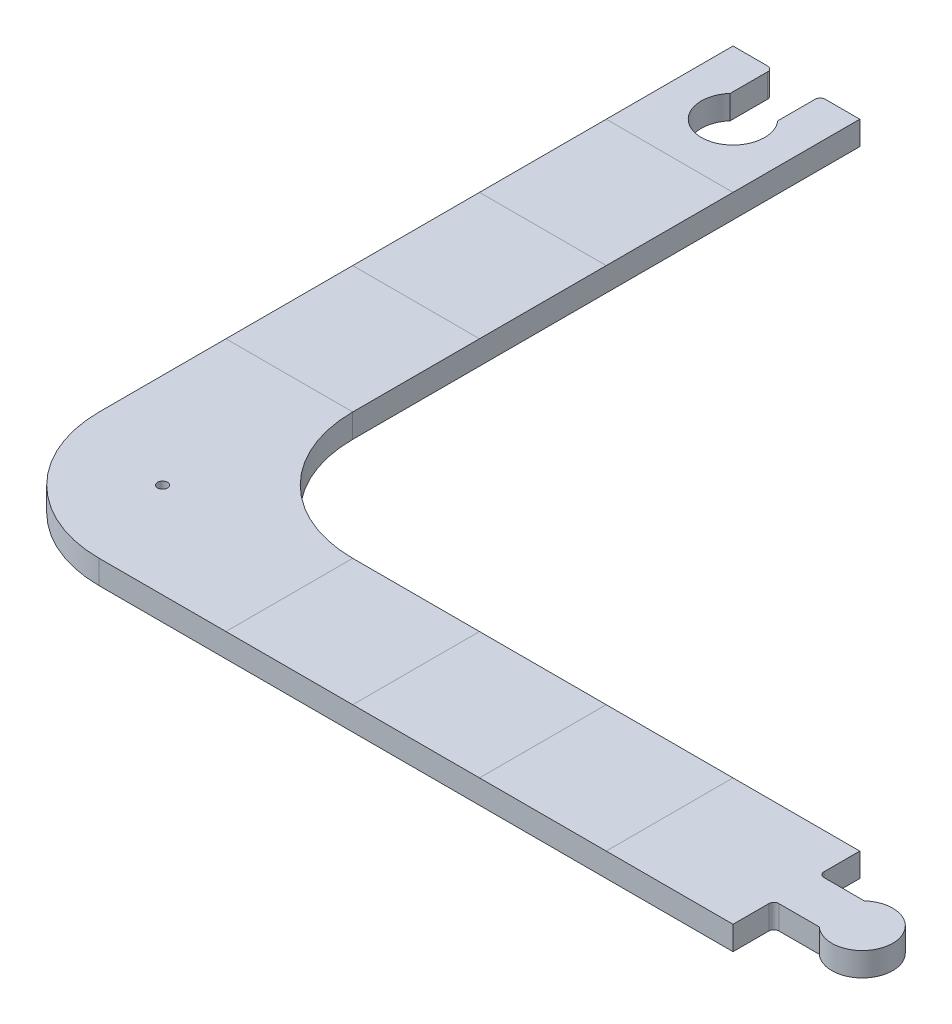
ISO-10303-21;
HEADER;
FILE_DESCRIPTION(('STEP AP214'),'2;1');
FILE_NAME('part.step','',(''),(''),'','','');
FILE_SCHEMA(('AUTOMOTIVE_DESIGN { 1 0 10303 214 1 1 1 1 }'));
ENDSEC;
DATA;
#1=APPLICATION_CONTEXT('core data for automotive mechanical design processes');
#2=APPLICATION_PROTOCOL_DEFINITION('international standard','automotive_design',2000,#1);
#3=PRODUCT_CONTEXT('',#1,'mechanical');
#4=PRODUCT('Part','Part','',(#3));
#5=PRODUCT_RELATED_PRODUCT_CATEGORY('part','',(#4));
#6=PRODUCT_DEFINITION_FORMATION('','',#4);
#7=PRODUCT_DEFINITION_CONTEXT('part definition',#1,'design');
#8=PRODUCT_DEFINITION('design','',#6,#7);
#9=PRODUCT_DEFINITION_SHAPE('','',#8);
#10=(LENGTH_UNIT() NAMED_UNIT(*) SI_UNIT(.MILLI.,.METRE.));
#11=(NAMED_UNIT(*) PLANE_ANGLE_UNIT() SI_UNIT($,.RADIAN.));
#12=(NAMED_UNIT(*) SI_UNIT($,.STERADIAN.) SOLID_ANGLE_UNIT());
#13=UNCERTAINTY_MEASURE_WITH_UNIT(LENGTH_MEASURE(1.E-05),#10,'distance_accuracy_value','');
#14=(GEOMETRIC_REPRESENTATION_CONTEXT(3) GLOBAL_UNCERTAINTY_ASSIGNED_CONTEXT((#13)) GLOBAL_UNIT_ASSIGNED_CONTEXT((#10,
#11,#12)) REPRESENTATION_CONTEXT('',''));
#15=CARTESIAN_POINT('',(0.,0.,0.));
#16=DIRECTION('',(0.,0.,1.));
#17=DIRECTION('',(1.,0.,0.));
#18=AXIS2_PLACEMENT_3D('',#15,#16,#17);
#19=CARTESIAN_POINT('',(25.4,4.7625,-25.4));
#20=DIRECTION('',(0.,1.,0.));
#21=DIRECTION('',(0.,0.,1.));
#22=AXIS2_PLACEMENT_3D('',#19,#20,#21);
#23=PLANE('',#22);
#24=CARTESIAN_POINT('',(19.0499999999999,4.7625,-19.05));
#25=DIRECTION('',(0.,1.,0.));
#26=DIRECTION('',(0.,0.,1.));
#27=AXIS2_PLACEMENT_3D('',#24,#25,#26);
#28=CIRCLE('',#27,1.);
#29=CARTESIAN_POINT('',(19.0499999999999,4.7625,-18.05));
#30=VERTEX_POINT('',#29);
#31=EDGE_CURVE('E248',#30,#30,#28,.T.);
#32=ORIENTED_EDGE('',*,*,#31,.F.);
#33=EDGE_LOOP('',(#32));
#34=FACE_BOUND('',#33,.T.);
#35=CARTESIAN_POINT('',(50.8,4.7625,-50.8));
#36=DIRECTION('',(0.,-1.,0.));
#37=DIRECTION('',(0.,0.,1.));
#38=AXIS2_PLACEMENT_3D('',#35,#36,#37);
#39=CIRCLE('',#38,25.4);
#40=CARTESIAN_POINT('',(50.8,4.7625,-25.4));
#41=VERTEX_POINT('',#40);
#42=CARTESIAN_POINT('',(25.4,4.7625,-50.8000000000002));
#43=VERTEX_POINT('',#42);
#44=EDGE_CURVE('E435',#41,#43,#39,.T.);
#45=ORIENTED_EDGE('',*,*,#44,.T.);
#46=DIRECTION('',(-1.,0.,0.));
#47=VECTOR('',#46,1.);
#48=CARTESIAN_POINT('',(25.4,4.7625,-50.8));
#49=LINE('',#48,#47);
#50=CARTESIAN_POINT('',(0.,4.7625,-50.8));
#51=VERTEX_POINT('',#50);
#52=EDGE_CURVE('E11',#43,#51,#49,.T.);
#53=ORIENTED_EDGE('',*,*,#52,.T.);
#54=DIRECTION('',(0.,0.,1.));
#55=VECTOR('',#54,1.);
#56=CARTESIAN_POINT('',(0.,4.7625,-25.4000000000002));
#57=LINE('',#56,#55);
#58=CARTESIAN_POINT('',(0.,4.7625,-25.4000000000002));
#59=VERTEX_POINT('',#58);
#60=EDGE_CURVE('E227',#51,#59,#57,.T.);
#61=ORIENTED_EDGE('',*,*,#60,.T.);
#62=CARTESIAN_POINT('',(25.4,4.7625,-25.4));
#63=DIRECTION('',(0.,1.,0.));
#64=DIRECTION('',(0.,0.,1.));
#65=AXIS2_PLACEMENT_3D('',#62,#63,#64);
#66=CIRCLE('',#65,25.4);
#67=CARTESIAN_POINT('',(25.4000000000002,4.7625,0.));
#68=VERTEX_POINT('',#67);
#69=EDGE_CURVE('E226',#59,#68,#66,.T.);
#70=ORIENTED_EDGE('',*,*,#69,.T.);
#71=DIRECTION('',(1.,0.,0.));
#72=VECTOR('',#71,1.);
#73=CARTESIAN_POINT('',(25.4000000000002,4.7625,0.));
#74=LINE('',#73,#72);
#75=CARTESIAN_POINT('',(50.8,4.7625,0.));
#76=VERTEX_POINT('',#75);
#77=EDGE_CURVE('E214',#68,#76,#74,.T.);
#78=ORIENTED_EDGE('',*,*,#77,.T.);
#79=DIRECTION('',(0.,0.,-1.));
#80=VECTOR('',#79,1.);
#81=CARTESIAN_POINT('',(50.8,4.7625,-25.4));
#82=LINE('',#81,#80);
#83=EDGE_CURVE('E258',#76,#41,#82,.T.);
#84=ORIENTED_EDGE('',*,*,#83,.T.);
#85=EDGE_LOOP('',(#45,#53,#61,#70,#78,#84));
#86=FACE_BOUND('',#85,.T.);
#87=ADVANCED_FACE('F35',(#34,#86),#23,.T.);
#88=ORIENTED_EDGE('',*,*,#52,.F.);
#89=DIRECTION('',(0.,0.,-1.));
#90=VECTOR('',#89,1.);
#91=CARTESIAN_POINT('',(25.4,4.7625,-152.4));
#92=LINE('',#91,#90);
#93=CARTESIAN_POINT('',(25.4,4.7625,-76.2));
#94=VERTEX_POINT('',#93);
#95=EDGE_CURVE('E439',#43,#94,#92,.T.);
#96=ORIENTED_EDGE('',*,*,#95,.T.);
#97=DIRECTION('',(-1.,0.,0.));
#98=VECTOR('',#97,1.);
#99=CARTESIAN_POINT('',(25.4,4.7625,-76.2));
#100=LINE('',#99,#98);
#101=CARTESIAN_POINT('',(0.,4.7625,-76.2));
#102=VERTEX_POINT('',#101);
#103=EDGE_CURVE('E44',#94,#102,#100,.T.);
#104=ORIENTED_EDGE('',*,*,#103,.T.);
#105=EDGE_CURVE('E297',#102,#51,#57,.T.);
#106=ORIENTED_EDGE('',*,*,#105,.T.);
#107=EDGE_LOOP('',(#88,#96,#104,#106));
#108=FACE_BOUND('',#107,.T.);
#109=ADVANCED_FACE('F456',(#108),#23,.T.);
#110=ORIENTED_EDGE('',*,*,#103,.F.);
#111=CARTESIAN_POINT('',(25.4,4.7625,-101.6));
#112=VERTEX_POINT('',#111);
#113=EDGE_CURVE('E287',#94,#112,#92,.T.);
#114=ORIENTED_EDGE('',*,*,#113,.T.);
#115=DIRECTION('',(-1.,0.,0.));
#116=VECTOR('',#115,1.);
#117=CARTESIAN_POINT('',(25.4,4.7625,-101.6));
#118=LINE('',#117,#116);
#119=CARTESIAN_POINT('',(0.,4.7625,-101.6));
#120=VERTEX_POINT('',#119);
#121=EDGE_CURVE('E261',#112,#120,#118,.T.);
#122=ORIENTED_EDGE('',*,*,#121,.T.);
#123=EDGE_CURVE('E285',#120,#102,#57,.T.);
#124=ORIENTED_EDGE('',*,*,#123,.T.);
#125=EDGE_LOOP('',(#110,#114,#122,#124));
#126=FACE_BOUND('',#125,.T.);
#127=ADVANCED_FACE('F284',(#126),#23,.T.);
#128=ORIENTED_EDGE('',*,*,#121,.F.);
#129=CARTESIAN_POINT('',(25.4,4.7625,-127.));
#130=VERTEX_POINT('',#129);
#131=EDGE_CURVE('E468',#112,#130,#92,.T.);
#132=ORIENTED_EDGE('',*,*,#131,.T.);
#133=DIRECTION('',(-1.,0.,0.));
#134=VECTOR('',#133,1.);
#135=CARTESIAN_POINT('',(25.4,4.7625,-127.));
#136=LINE('',#135,#134);
#137=CARTESIAN_POINT('',(0.,4.7625,-127.));
#138=VERTEX_POINT('',#137);
#139=EDGE_CURVE('E239',#130,#138,#136,.T.);
#140=ORIENTED_EDGE('',*,*,#139,.T.);
#141=EDGE_CURVE('E295',#138,#120,#57,.T.);
#142=ORIENTED_EDGE('',*,*,#141,.T.);
#143=EDGE_LOOP('',(#128,#132,#140,#142));
#144=FACE_BOUND('',#143,.T.);
#145=ADVANCED_FACE('F299',(#144),#23,.T.);
#146=ORIENTED_EDGE('',*,*,#83,.F.);
#147=CARTESIAN_POINT('',(76.2,4.7625,0.));
#148=VERTEX_POINT('',#147);
#149=EDGE_CURVE('E221',#76,#148,#74,.T.);
#150=ORIENTED_EDGE('',*,*,#149,.T.);
#151=DIRECTION('',(0.,0.,-1.));
#152=VECTOR('',#151,1.);
#153=CARTESIAN_POINT('',(76.2,4.7625,-25.4000000000001));
#154=LINE('',#153,#152);
#155=CARTESIAN_POINT('',(76.2,4.7625,-25.4));
#156=VERTEX_POINT('',#155);
#157=EDGE_CURVE('E255',#148,#156,#154,.T.);
#158=ORIENTED_EDGE('',*,*,#157,.T.);
#159=DIRECTION('',(-1.,0.,0.));
#160=VECTOR('',#159,1.);
#161=CARTESIAN_POINT('',(152.4,4.7625,-25.4));
#162=LINE('',#161,#160);
#163=EDGE_CURVE('E431',#156,#41,#162,.T.);
#164=ORIENTED_EDGE('',*,*,#163,.T.);
#165=EDGE_LOOP('',(#146,#150,#158,#164));
#166=FACE_BOUND('',#165,.T.);
#167=ADVANCED_FACE('F541',(#166),#23,.T.);
#168=ORIENTED_EDGE('',*,*,#157,.F.);
#169=CARTESIAN_POINT('',(101.6,4.7625,0.));
#170=VERTEX_POINT('',#169);
#171=EDGE_CURVE('E550',#148,#170,#74,.T.);
#172=ORIENTED_EDGE('',*,*,#171,.T.);
#173=DIRECTION('',(0.,0.,-1.));
#174=VECTOR('',#173,1.);
#175=CARTESIAN_POINT('',(101.6,4.7625,-25.4000000000001));
#176=LINE('',#175,#174);
#177=CARTESIAN_POINT('',(101.6,4.7625,-25.4));
#178=VERTEX_POINT('',#177);
#179=EDGE_CURVE('E252',#170,#178,#176,.T.);
#180=ORIENTED_EDGE('',*,*,#179,.T.);
#181=EDGE_CURVE('E555',#178,#156,#162,.T.);
#182=ORIENTED_EDGE('',*,*,#181,.T.);
#183=EDGE_LOOP('',(#168,#172,#180,#182));
#184=FACE_BOUND('',#183,.T.);
#185=ADVANCED_FACE('F536',(#184),#23,.T.);
#186=ORIENTED_EDGE('',*,*,#179,.F.);
#187=CARTESIAN_POINT('',(127.,4.7625,0.));
#188=VERTEX_POINT('',#187);
#189=EDGE_CURVE('E546',#170,#188,#74,.T.);
#190=ORIENTED_EDGE('',*,*,#189,.T.);
#191=DIRECTION('',(0.,0.,-1.));
#192=VECTOR('',#191,1.);
#193=CARTESIAN_POINT('',(127.,4.7625,-25.4000000000001));
#194=LINE('',#193,#192);
#195=CARTESIAN_POINT('',(127.,4.7625,-25.4));
#196=VERTEX_POINT('',#195);
#197=EDGE_CURVE('E235',#188,#196,#194,.T.);
#198=ORIENTED_EDGE('',*,*,#197,.T.);
#199=EDGE_CURVE('E436',#196,#178,#162,.T.);
#200=ORIENTED_EDGE('',*,*,#199,.T.);
#201=EDGE_LOOP('',(#186,#190,#198,#200));
#202=FACE_BOUND('',#201,.T.);
#203=ADVANCED_FACE('F531',(#202),#23,.T.);
#204=ORIENTED_EDGE('',*,*,#139,.F.);
#205=CARTESIAN_POINT('',(25.4,4.7625,-152.4));
#206=VERTEX_POINT('',#205);
#207=EDGE_CURVE('E438',#130,#206,#92,.T.);
#208=ORIENTED_EDGE('',*,*,#207,.T.);
#209=DIRECTION('',(-1.,0.,0.));
#210=VECTOR('',#209,1.);
#211=CARTESIAN_POINT('',(18.4625,4.7625,-152.4));
#212=LINE('',#211,#210);
#213=CARTESIAN_POINT('',(18.4625,4.7625,-152.4));
#214=VERTEX_POINT('',#213);
#215=EDGE_CURVE('E441',#206,#214,#212,.T.);
#216=ORIENTED_EDGE('',*,*,#215,.T.);
#217=CARTESIAN_POINT('',(18.4625,4.7625,-151.4));
#218=DIRECTION('',(0.,1.,0.));
#219=DIRECTION('',(0.,0.,1.));
#220=AXIS2_PLACEMENT_3D('',#217,#218,#219);
#221=CIRCLE('',#220,1.);
#222=CARTESIAN_POINT('',(17.4625,4.7625,-151.4));
#223=VERTEX_POINT('',#222);
#224=EDGE_CURVE('E443',#214,#223,#221,.T.);
#225=ORIENTED_EDGE('',*,*,#224,.T.);
#226=DIRECTION('',(0.,0.,1.));
#227=VECTOR('',#226,1.);
#228=CARTESIAN_POINT('',(17.4625,4.7625,-151.4));
#229=LINE('',#228,#227);
#230=CARTESIAN_POINT('',(17.4625,4.7625,-143.900130206315));
#231=VERTEX_POINT('',#230);
#232=EDGE_CURVE('E445',#223,#231,#229,.T.);
#233=ORIENTED_EDGE('',*,*,#232,.T.);
#234=CARTESIAN_POINT('',(12.7,4.7625,-139.7));
#235=DIRECTION('',(0.,-1.,0.));
#236=DIRECTION('',(0.,0.,1.));
#237=AXIS2_PLACEMENT_3D('',#234,#235,#236);
#238=CIRCLE('',#237,6.35);
#239=CARTESIAN_POINT('',(7.9375,4.7625,-143.900130206315));
#240=VERTEX_POINT('',#239);
#241=EDGE_CURVE('E447',#231,#240,#238,.T.);
#242=ORIENTED_EDGE('',*,*,#241,.T.);
#243=DIRECTION('',(0.,0.,-1.));
#244=VECTOR('',#243,1.);
#245=CARTESIAN_POINT('',(7.9375,4.7625,-151.4));
#246=LINE('',#245,#244);
#247=CARTESIAN_POINT('',(7.9375,4.7625,-151.4));
#248=VERTEX_POINT('',#247);
#249=EDGE_CURVE('E449',#240,#248,#246,.T.);
#250=ORIENTED_EDGE('',*,*,#249,.T.);
#251=CARTESIAN_POINT('',(6.9375,4.7625,-151.4));
#252=DIRECTION('',(0.,1.,0.));
#253=DIRECTION('',(0.,0.,-1.));
#254=AXIS2_PLACEMENT_3D('',#251,#252,#253);
#255=CIRCLE('',#254,1.);
#256=CARTESIAN_POINT('',(6.93749999999999,4.7625,-152.4));
#257=VERTEX_POINT('',#256);
#258=EDGE_CURVE('E450',#248,#257,#255,.T.);
#259=ORIENTED_EDGE('',*,*,#258,.T.);
#260=DIRECTION('',(-1.,0.,0.));
#261=VECTOR('',#260,1.);
#262=CARTESIAN_POINT('',(0.,4.7625,-152.4));
#263=LINE('',#262,#261);
#264=CARTESIAN_POINT('',(0.,4.7625,-152.4));
#265=VERTEX_POINT('',#264);
#266=EDGE_CURVE('E305',#257,#265,#263,.T.);
#267=ORIENTED_EDGE('',*,*,#266,.T.);
#268=EDGE_CURVE('E301',#265,#138,#57,.T.);
#269=ORIENTED_EDGE('',*,*,#268,.T.);
#270=EDGE_LOOP('',(#204,#208,#216,#225,#233,#242,#250,#259,#267,#269));
#271=FACE_BOUND('',#270,.T.);
#272=ADVANCED_FACE('F470',(#271),#23,.T.);
#273=CARTESIAN_POINT('',(25.4,4.7625,-25.4));
#274=DIRECTION('',(0.,-1.,0.));
#275=DIRECTION('',(0.,0.,-1.));
#276=AXIS2_PLACEMENT_3D('',#273,#274,#275);
#277=CYLINDRICAL_SURFACE('',#276,25.4);
#278=CARTESIAN_POINT('',(25.4,0.,-25.4));
#279=DIRECTION('',(0.,1.,0.));
#280=DIRECTION('',(0.,0.,1.));
#281=AXIS2_PLACEMENT_3D('',#278,#279,#280);
#282=CIRCLE('',#281,25.4);
#283=CARTESIAN_POINT('',(0.,0.,-25.4000000000002));
#284=VERTEX_POINT('',#283);
#285=CARTESIAN_POINT('',(25.4000000000002,0.,0.));
#286=VERTEX_POINT('',#285);
#287=EDGE_CURVE('E234',#284,#286,#282,.T.);
#288=ORIENTED_EDGE('',*,*,#287,.T.);
#289=DIRECTION('',(0.,-1.,0.));
#290=VECTOR('',#289,1.);
#291=CARTESIAN_POINT('',(25.4000000000002,4.7625,0.));
#292=LINE('',#291,#290);
#293=EDGE_CURVE('E218',#68,#286,#292,.T.);
#294=ORIENTED_EDGE('',*,*,#293,.F.);
#295=ORIENTED_EDGE('',*,*,#69,.F.);
#296=DIRECTION('',(0.,-1.,0.));
#297=VECTOR('',#296,1.);
#298=CARTESIAN_POINT('',(0.,4.7625,-25.4000000000002));
#299=LINE('',#298,#297);
#300=EDGE_CURVE('E302',#59,#284,#299,.T.);
#301=ORIENTED_EDGE('',*,*,#300,.T.);
#302=EDGE_LOOP('',(#288,#294,#295,#301));
#303=FACE_BOUND('',#302,.T.);
#304=ADVANCED_FACE('F37',(#303),#277,.T.);
#305=CARTESIAN_POINT('',(25.4000000000002,4.7625,0.));
#306=DIRECTION('',(0.,0.,-1.));
#307=DIRECTION('',(-1.,0.,0.));
#308=AXIS2_PLACEMENT_3D('',#305,#306,#307);
#309=PLANE('',#308);
#310=DIRECTION('',(1.,0.,0.));
#311=VECTOR('',#310,1.);
#312=CARTESIAN_POINT('',(25.4000000000002,0.,0.));
#313=LINE('',#312,#311);
#314=CARTESIAN_POINT('',(152.4,0.,0.));
#315=VERTEX_POINT('',#314);
#316=EDGE_CURVE('E308',#286,#315,#313,.T.);
#317=ORIENTED_EDGE('',*,*,#316,.T.);
#318=DIRECTION('',(0.,-1.,0.));
#319=VECTOR('',#318,1.);
#320=CARTESIAN_POINT('',(152.4,4.7625,0.));
#321=LINE('',#320,#319);
#322=CARTESIAN_POINT('',(152.4,4.7625,0.));
#323=VERTEX_POINT('',#322);
#324=EDGE_CURVE('E236',#323,#315,#321,.T.);
#325=ORIENTED_EDGE('',*,*,#324,.F.);
#326=EDGE_CURVE('E224',#188,#323,#74,.T.);
#327=ORIENTED_EDGE('',*,*,#326,.F.);
#328=ORIENTED_EDGE('',*,*,#189,.F.);
#329=ORIENTED_EDGE('',*,*,#171,.F.);
#330=ORIENTED_EDGE('',*,*,#149,.F.);
#331=ORIENTED_EDGE('',*,*,#77,.F.);
#332=ORIENTED_EDGE('',*,*,#293,.T.);
#333=EDGE_LOOP('',(#317,#325,#327,#328,#329,#330,#331,#332));
#334=FACE_BOUND('',#333,.T.);
#335=ADVANCED_FACE('F216',(#334),#309,.F.);
#336=CARTESIAN_POINT('',(152.4,4.7625,-7.1875));
#337=DIRECTION('',(-1.,0.,0.));
#338=DIRECTION('',(0.,0.,1.));
#339=AXIS2_PLACEMENT_3D('',#336,#337,#338);
#340=PLANE('',#339);
#341=DIRECTION('',(0.,0.,-1.));
#342=VECTOR('',#341,1.);
#343=CARTESIAN_POINT('',(152.4,0.,-7.1875));
#344=LINE('',#343,#342);
#345=CARTESIAN_POINT('',(152.4,0.,-7.1875));
#346=VERTEX_POINT('',#345);
#347=EDGE_CURVE('E310',#315,#346,#344,.T.);
#348=ORIENTED_EDGE('',*,*,#347,.T.);
#349=DIRECTION('',(0.,-1.,0.));
#350=VECTOR('',#349,1.);
#351=CARTESIAN_POINT('',(152.4,4.7625,-7.1875));
#352=LINE('',#351,#350);
#353=CARTESIAN_POINT('',(152.4,4.7625,-7.1875));
#354=VERTEX_POINT('',#353);
#355=EDGE_CURVE('E242',#354,#346,#352,.T.);
#356=ORIENTED_EDGE('',*,*,#355,.F.);
#357=DIRECTION('',(0.,0.,-1.));
#358=VECTOR('',#357,1.);
#359=CARTESIAN_POINT('',(152.4,4.7625,-7.1875));
#360=LINE('',#359,#358);
#361=EDGE_CURVE('E222',#323,#354,#360,.T.);
#362=ORIENTED_EDGE('',*,*,#361,.F.);
#363=ORIENTED_EDGE('',*,*,#324,.T.);
#364=EDGE_LOOP('',(#348,#356,#362,#363));
#365=FACE_BOUND('',#364,.T.);
#366=ADVANCED_FACE('F505',(#365),#340,.F.);
#367=CARTESIAN_POINT('',(153.4,4.7625,-7.1875));
#368=DIRECTION('',(0.,-1.,0.));
#369=DIRECTION('',(0.,0.,-1.));
#370=AXIS2_PLACEMENT_3D('',#367,#368,#369);
#371=CYLINDRICAL_SURFACE('',#370,1.00000000000001);
#372=CARTESIAN_POINT('',(153.4,0.,-7.1875));
#373=DIRECTION('',(0.,-1.,0.));
#374=DIRECTION('',(0.,0.,-1.));
#375=AXIS2_PLACEMENT_3D('',#372,#373,#374);
#376=CIRCLE('',#375,1.00000000000001);
#377=CARTESIAN_POINT('',(153.4,0.,-8.1875));
#378=VERTEX_POINT('',#377);
#379=EDGE_CURVE('E312',#346,#378,#376,.T.);
#380=ORIENTED_EDGE('',*,*,#379,.T.);
#381=DIRECTION('',(0.,-1.,0.));
#382=VECTOR('',#381,1.);
#383=CARTESIAN_POINT('',(153.4,4.7625,-8.1875));
#384=LINE('',#383,#382);
#385=CARTESIAN_POINT('',(153.4,4.7625,-8.1875));
#386=VERTEX_POINT('',#385);
#387=EDGE_CURVE('E391',#386,#378,#384,.T.);
#388=ORIENTED_EDGE('',*,*,#387,.F.);
#389=CARTESIAN_POINT('',(153.4,4.7625,-7.1875));
#390=DIRECTION('',(0.,-1.,0.));
#391=DIRECTION('',(0.,0.,-1.));
#392=AXIS2_PLACEMENT_3D('',#389,#390,#391);
#393=CIRCLE('',#392,1.00000000000001);
#394=EDGE_CURVE('E400',#354,#386,#393,.T.);
#395=ORIENTED_EDGE('',*,*,#394,.F.);
#396=ORIENTED_EDGE('',*,*,#355,.T.);
#397=EDGE_LOOP('',(#380,#388,#395,#396));
#398=FACE_BOUND('',#397,.T.);
#399=ADVANCED_FACE('F398',(#398),#371,.F.);
#400=CARTESIAN_POINT('',(153.4,4.7625,-8.1875));
#401=DIRECTION('',(0.,0.,-1.));
#402=DIRECTION('',(-1.,0.,0.));
#403=AXIS2_PLACEMENT_3D('',#400,#401,#402);
#404=PLANE('',#403);
#405=DIRECTION('',(1.,0.,0.));
#406=VECTOR('',#405,1.);
#407=CARTESIAN_POINT('',(153.4,0.,-8.1875));
#408=LINE('',#407,#406);
#409=CARTESIAN_POINT('',(161.495448410606,0.,-8.1875));
#410=VERTEX_POINT('',#409);
#411=EDGE_CURVE('E314',#378,#410,#408,.T.);
#412=ORIENTED_EDGE('',*,*,#411,.T.);
#413=DIRECTION('',(0.,-1.,0.));
#414=VECTOR('',#413,1.);
#415=CARTESIAN_POINT('',(161.495448410606,4.7625,-8.1875));
#416=LINE('',#415,#414);
#417=CARTESIAN_POINT('',(161.495448410606,4.7625,-8.1875));
#418=VERTEX_POINT('',#417);
#419=EDGE_CURVE('E388',#418,#410,#416,.T.);
#420=ORIENTED_EDGE('',*,*,#419,.F.);
#421=DIRECTION('',(1.,0.,0.));
#422=VECTOR('',#421,1.);
#423=CARTESIAN_POINT('',(153.4,4.7625,-8.1875));
#424=LINE('',#423,#422);
#425=EDGE_CURVE('E421',#386,#418,#424,.T.);
#426=ORIENTED_EDGE('',*,*,#425,.F.);
#427=ORIENTED_EDGE('',*,*,#387,.T.);
#428=EDGE_LOOP('',(#412,#420,#426,#427));
#429=FACE_BOUND('',#428,.T.);
#430=ADVANCED_FACE('F411',(#429),#404,.F.);
#431=CARTESIAN_POINT('',(165.6,4.7625,-12.7));
#432=DIRECTION('',(0.,-1.,0.));
#433=DIRECTION('',(0.,0.,-1.));
#434=AXIS2_PLACEMENT_3D('',#431,#432,#433);
#435=CYLINDRICAL_SURFACE('',#434,6.09999999999999);
#436=CARTESIAN_POINT('',(165.6,0.,-12.7));
#437=DIRECTION('',(0.,1.,0.));
#438=DIRECTION('',(0.,0.,1.));
#439=AXIS2_PLACEMENT_3D('',#436,#437,#438);
#440=CIRCLE('',#439,6.09999999999999);
#441=CARTESIAN_POINT('',(161.495448410606,0.,-17.2125));
#442=VERTEX_POINT('',#441);
#443=EDGE_CURVE('E316',#410,#442,#440,.T.);
#444=ORIENTED_EDGE('',*,*,#443,.T.);
#445=DIRECTION('',(0.,-1.,0.));
#446=VECTOR('',#445,1.);
#447=CARTESIAN_POINT('',(161.495448410606,4.7625,-17.2125));
#448=LINE('',#447,#446);
#449=CARTESIAN_POINT('',(161.495448410606,4.7625,-17.2125));
#450=VERTEX_POINT('',#449);
#451=EDGE_CURVE('E385',#450,#442,#448,.T.);
#452=ORIENTED_EDGE('',*,*,#451,.F.);
#453=CARTESIAN_POINT('',(165.6,4.7625,-12.7));
#454=DIRECTION('',(0.,1.,0.));
#455=DIRECTION('',(0.,0.,1.));
#456=AXIS2_PLACEMENT_3D('',#453,#454,#455);
#457=CIRCLE('',#456,6.09999999999999);
#458=EDGE_CURVE('E417',#418,#450,#457,.T.);
#459=ORIENTED_EDGE('',*,*,#458,.F.);
#460=ORIENTED_EDGE('',*,*,#419,.T.);
#461=EDGE_LOOP('',(#444,#452,#459,#460));
#462=FACE_BOUND('',#461,.T.);
#463=ADVANCED_FACE('F415',(#462),#435,.T.);
#464=CARTESIAN_POINT('',(153.4,4.7625,-17.2125));
#465=DIRECTION('',(0.,0.,1.));
#466=DIRECTION('',(1.,0.,0.));
#467=AXIS2_PLACEMENT_3D('',#464,#465,#466);
#468=PLANE('',#467);
#469=DIRECTION('',(-1.,0.,0.));
#470=VECTOR('',#469,1.);
#471=CARTESIAN_POINT('',(153.4,0.,-17.2125));
#472=LINE('',#471,#470);
#473=CARTESIAN_POINT('',(153.4,0.,-17.2125));
#474=VERTEX_POINT('',#473);
#475=EDGE_CURVE('E318',#442,#474,#472,.T.);
#476=ORIENTED_EDGE('',*,*,#475,.T.);
#477=DIRECTION('',(0.,-1.,0.));
#478=VECTOR('',#477,1.);
#479=CARTESIAN_POINT('',(153.4,4.7625,-17.2125));
#480=LINE('',#479,#478);
#481=CARTESIAN_POINT('',(153.4,4.7625,-17.2125));
#482=VERTEX_POINT('',#481);
#483=EDGE_CURVE('E382',#482,#474,#480,.T.);
#484=ORIENTED_EDGE('',*,*,#483,.F.);
#485=DIRECTION('',(-1.,0.,0.));
#486=VECTOR('',#485,1.);
#487=CARTESIAN_POINT('',(153.4,4.7625,-17.2125));
#488=LINE('',#487,#486);
#489=EDGE_CURVE('E420',#450,#482,#488,.T.);
#490=ORIENTED_EDGE('',*,*,#489,.F.);
#491=ORIENTED_EDGE('',*,*,#451,.T.);
#492=EDGE_LOOP('',(#476,#484,#490,#491));
#493=FACE_BOUND('',#492,.T.);
#494=ADVANCED_FACE('F572',(#493),#468,.F.);
#495=CARTESIAN_POINT('',(153.4,4.7625,-18.2125));
#496=DIRECTION('',(0.,-1.,0.));
#497=DIRECTION('',(0.,0.,-1.));
#498=AXIS2_PLACEMENT_3D('',#495,#496,#497);
#499=CYLINDRICAL_SURFACE('',#498,1.00000000000001);
#500=CARTESIAN_POINT('',(153.4,0.,-18.2125));
#501=DIRECTION('',(0.,-1.,0.));
#502=DIRECTION('',(0.,0.,1.));
#503=AXIS2_PLACEMENT_3D('',#500,#501,#502);
#504=CIRCLE('',#503,1.00000000000001);
#505=CARTESIAN_POINT('',(152.4,0.,-18.2125));
#506=VERTEX_POINT('',#505);
#507=EDGE_CURVE('E320',#474,#506,#504,.T.);
#508=ORIENTED_EDGE('',*,*,#507,.T.);
#509=DIRECTION('',(0.,-1.,0.));
#510=VECTOR('',#509,1.);
#511=CARTESIAN_POINT('',(152.4,4.7625,-18.2125));
#512=LINE('',#511,#510);
#513=CARTESIAN_POINT('',(152.4,4.7625,-18.2125));
#514=VERTEX_POINT('',#513);
#515=EDGE_CURVE('E379',#514,#506,#512,.T.);
#516=ORIENTED_EDGE('',*,*,#515,.F.);
#517=CARTESIAN_POINT('',(153.4,4.7625,-18.2125));
#518=DIRECTION('',(0.,-1.,0.));
#519=DIRECTION('',(0.,0.,1.));
#520=AXIS2_PLACEMENT_3D('',#517,#518,#519);
#521=CIRCLE('',#520,1.00000000000001);
#522=EDGE_CURVE('E423',#482,#514,#521,.T.);
#523=ORIENTED_EDGE('',*,*,#522,.F.);
#524=ORIENTED_EDGE('',*,*,#483,.T.);
#525=EDGE_LOOP('',(#508,#516,#523,#524));
#526=FACE_BOUND('',#525,.T.);
#527=ADVANCED_FACE('F569',(#526),#499,.F.);
#528=CARTESIAN_POINT('',(152.4,4.7625,-25.4));
#529=DIRECTION('',(-1.,0.,0.));
#530=DIRECTION('',(0.,0.,1.));
#531=AXIS2_PLACEMENT_3D('',#528,#529,#530);
#532=PLANE('',#531);
#533=DIRECTION('',(0.,0.,-1.));
#534=VECTOR('',#533,1.);
#535=CARTESIAN_POINT('',(152.4,0.,-25.4));
#536=LINE('',#535,#534);
#537=CARTESIAN_POINT('',(152.4,0.,-25.4));
#538=VERTEX_POINT('',#537);
#539=EDGE_CURVE('E322',#506,#538,#536,.T.);
#540=ORIENTED_EDGE('',*,*,#539,.T.);
#541=DIRECTION('',(0.,-1.,0.));
#542=VECTOR('',#541,1.);
#543=CARTESIAN_POINT('',(152.4,4.7625,-25.4));
#544=LINE('',#543,#542);
#545=CARTESIAN_POINT('',(152.4,4.7625,-25.4));
#546=VERTEX_POINT('',#545);
#547=EDGE_CURVE('E376',#546,#538,#544,.T.);
#548=ORIENTED_EDGE('',*,*,#547,.F.);
#549=DIRECTION('',(0.,0.,-1.));
#550=VECTOR('',#549,1.);
#551=CARTESIAN_POINT('',(152.4,4.7625,-25.4));
#552=LINE('',#551,#550);
#553=EDGE_CURVE('E429',#514,#546,#552,.T.);
#554=ORIENTED_EDGE('',*,*,#553,.F.);
#555=ORIENTED_EDGE('',*,*,#515,.T.);
#556=EDGE_LOOP('',(#540,#548,#554,#555));
#557=FACE_BOUND('',#556,.T.);
#558=ADVANCED_FACE('F564',(#557),#532,.F.);
#559=CARTESIAN_POINT('',(152.4,4.7625,-25.4));
#560=DIRECTION('',(0.,0.,1.));
#561=DIRECTION('',(1.,0.,0.));
#562=AXIS2_PLACEMENT_3D('',#559,#560,#561);
#563=PLANE('',#562);
#564=DIRECTION('',(-1.,0.,0.));
#565=VECTOR('',#564,1.);
#566=CARTESIAN_POINT('',(152.4,0.,-25.4));
#567=LINE('',#566,#565);
#568=CARTESIAN_POINT('',(50.8,0.,-25.4));
#569=VERTEX_POINT('',#568);
#570=EDGE_CURVE('E324',#538,#569,#567,.T.);
#571=ORIENTED_EDGE('',*,*,#570,.T.);
#572=DIRECTION('',(0.,-1.,0.));
#573=VECTOR('',#572,1.);
#574=CARTESIAN_POINT('',(50.8,4.7625,-25.4));
#575=LINE('',#574,#573);
#576=EDGE_CURVE('E373',#41,#569,#575,.T.);
#577=ORIENTED_EDGE('',*,*,#576,.F.);
#578=ORIENTED_EDGE('',*,*,#163,.F.);
#579=ORIENTED_EDGE('',*,*,#181,.F.);
#580=ORIENTED_EDGE('',*,*,#199,.F.);
#581=EDGE_CURVE('E432',#546,#196,#162,.T.);
#582=ORIENTED_EDGE('',*,*,#581,.F.);
#583=ORIENTED_EDGE('',*,*,#547,.T.);
#584=EDGE_LOOP('',(#571,#577,#578,#579,#580,#582,#583));
#585=FACE_BOUND('',#584,.T.);
#586=ADVANCED_FACE('F553',(#585),#563,.F.);
#587=CARTESIAN_POINT('',(50.8,4.7625,-50.8));
#588=DIRECTION('',(0.,-1.,0.));
#589=DIRECTION('',(0.,0.,-1.));
#590=AXIS2_PLACEMENT_3D('',#587,#588,#589);
#591=CYLINDRICAL_SURFACE('',#590,25.4);
#592=CARTESIAN_POINT('',(50.8,0.,-50.8));
#593=DIRECTION('',(0.,-1.,0.));
#594=DIRECTION('',(0.,0.,1.));
#595=AXIS2_PLACEMENT_3D('',#592,#593,#594);
#596=CIRCLE('',#595,25.4);
#597=CARTESIAN_POINT('',(25.4,0.,-50.8000000000002));
#598=VERTEX_POINT('',#597);
#599=EDGE_CURVE('E326',#569,#598,#596,.T.);
#600=ORIENTED_EDGE('',*,*,#599,.T.);
#601=DIRECTION('',(0.,-1.,0.));
#602=VECTOR('',#601,1.);
#603=CARTESIAN_POINT('',(25.4,4.7625,-50.8000000000002));
#604=LINE('',#603,#602);
#605=EDGE_CURVE('E370',#43,#598,#604,.T.);
#606=ORIENTED_EDGE('',*,*,#605,.F.);
#607=ORIENTED_EDGE('',*,*,#44,.F.);
#608=ORIENTED_EDGE('',*,*,#576,.T.);
#609=EDGE_LOOP('',(#600,#606,#607,#608));
#610=FACE_BOUND('',#609,.T.);
#611=ADVANCED_FACE('F462',(#610),#591,.F.);
#612=CARTESIAN_POINT('',(25.4,4.7625,-152.4));
#613=DIRECTION('',(-1.,0.,0.));
#614=DIRECTION('',(0.,0.,1.));
#615=AXIS2_PLACEMENT_3D('',#612,#613,#614);
#616=PLANE('',#615);
#617=DIRECTION('',(0.,0.,-1.));
#618=VECTOR('',#617,1.);
#619=CARTESIAN_POINT('',(25.4,0.,-152.4));
#620=LINE('',#619,#618);
#621=CARTESIAN_POINT('',(25.4,0.,-152.4));
#622=VERTEX_POINT('',#621);
#623=EDGE_CURVE('E328',#598,#622,#620,.T.);
#624=ORIENTED_EDGE('',*,*,#623,.T.);
#625=DIRECTION('',(0.,-1.,0.));
#626=VECTOR('',#625,1.);
#627=CARTESIAN_POINT('',(25.4,4.7625,-152.4));
#628=LINE('',#627,#626);
#629=EDGE_CURVE('E367',#206,#622,#628,.T.);
#630=ORIENTED_EDGE('',*,*,#629,.F.);
#631=ORIENTED_EDGE('',*,*,#207,.F.);
#632=ORIENTED_EDGE('',*,*,#131,.F.);
#633=ORIENTED_EDGE('',*,*,#113,.F.);
#634=ORIENTED_EDGE('',*,*,#95,.F.);
#635=ORIENTED_EDGE('',*,*,#605,.T.);
#636=EDGE_LOOP('',(#624,#630,#631,#632,#633,#634,#635));
#637=FACE_BOUND('',#636,.T.);
#638=ADVANCED_FACE('F466',(#637),#616,.F.);
#639=CARTESIAN_POINT('',(18.4625,4.7625,-152.4));
#640=DIRECTION('',(0.,0.,1.));
#641=DIRECTION('',(1.,0.,0.));
#642=AXIS2_PLACEMENT_3D('',#639,#640,#641);
#643=PLANE('',#642);
#644=DIRECTION('',(-1.,0.,0.));
#645=VECTOR('',#644,1.);
#646=CARTESIAN_POINT('',(18.4625,0.,-152.4));
#647=LINE('',#646,#645);
#648=CARTESIAN_POINT('',(18.4625,0.,-152.4));
#649=VERTEX_POINT('',#648);
#650=EDGE_CURVE('E330',#622,#649,#647,.T.);
#651=ORIENTED_EDGE('',*,*,#650,.T.);
#652=DIRECTION('',(0.,-1.,0.));
#653=VECTOR('',#652,1.);
#654=CARTESIAN_POINT('',(18.4625,4.7625,-152.4));
#655=LINE('',#654,#653);
#656=EDGE_CURVE('E364',#214,#649,#655,.T.);
#657=ORIENTED_EDGE('',*,*,#656,.F.);
#658=ORIENTED_EDGE('',*,*,#215,.F.);
#659=ORIENTED_EDGE('',*,*,#629,.T.);
#660=EDGE_LOOP('',(#651,#657,#658,#659));
#661=FACE_BOUND('',#660,.T.);
#662=ADVANCED_FACE('F475',(#661),#643,.F.);
#663=CARTESIAN_POINT('',(18.4625,4.7625,-151.4));
#664=DIRECTION('',(0.,-1.,0.));
#665=DIRECTION('',(0.,0.,-1.));
#666=AXIS2_PLACEMENT_3D('',#663,#664,#665);
#667=CYLINDRICAL_SURFACE('',#666,1.);
#668=CARTESIAN_POINT('',(18.4625,0.,-151.4));
#669=DIRECTION('',(0.,1.,0.));
#670=DIRECTION('',(0.,0.,1.));
#671=AXIS2_PLACEMENT_3D('',#668,#669,#670);
#672=CIRCLE('',#671,1.);
#673=CARTESIAN_POINT('',(17.4625,0.,-151.4));
#674=VERTEX_POINT('',#673);
#675=EDGE_CURVE('E332',#649,#674,#672,.T.);
#676=ORIENTED_EDGE('',*,*,#675,.T.);
#677=DIRECTION('',(0.,-1.,0.));
#678=VECTOR('',#677,1.);
#679=CARTESIAN_POINT('',(17.4625,4.7625,-151.4));
#680=LINE('',#679,#678);
#681=EDGE_CURVE('E361',#223,#674,#680,.T.);
#682=ORIENTED_EDGE('',*,*,#681,.F.);
#683=ORIENTED_EDGE('',*,*,#224,.F.);
#684=ORIENTED_EDGE('',*,*,#656,.T.);
#685=EDGE_LOOP('',(#676,#682,#683,#684));
#686=FACE_BOUND('',#685,.T.);
#687=ADVANCED_FACE('F480',(#686),#667,.T.);
#688=CARTESIAN_POINT('',(17.4625,4.7625,-151.4));
#689=DIRECTION('',(1.,0.,0.));
#690=DIRECTION('',(0.,0.,-1.));
#691=AXIS2_PLACEMENT_3D('',#688,#689,#690);
#692=PLANE('',#691);
#693=DIRECTION('',(0.,0.,1.));
#694=VECTOR('',#693,1.);
#695=CARTESIAN_POINT('',(17.4625,0.,-151.4));
#696=LINE('',#695,#694);
#697=CARTESIAN_POINT('',(17.4625,0.,-143.900130206315));
#698=VERTEX_POINT('',#697);
#699=EDGE_CURVE('E334',#674,#698,#696,.T.);
#700=ORIENTED_EDGE('',*,*,#699,.T.);
#701=DIRECTION('',(0.,-1.,0.));
#702=VECTOR('',#701,1.);
#703=CARTESIAN_POINT('',(17.4625,4.7625,-143.900130206315));
#704=LINE('',#703,#702);
#705=EDGE_CURVE('E358',#231,#698,#704,.T.);
#706=ORIENTED_EDGE('',*,*,#705,.F.);
#707=ORIENTED_EDGE('',*,*,#232,.F.);
#708=ORIENTED_EDGE('',*,*,#681,.T.);
#709=EDGE_LOOP('',(#700,#706,#707,#708));
#710=FACE_BOUND('',#709,.T.);
#711=ADVANCED_FACE('F486',(#710),#692,.F.);
#712=CARTESIAN_POINT('',(12.7,4.7625,-139.7));
#713=DIRECTION('',(0.,-1.,0.));
#714=DIRECTION('',(0.,0.,-1.));
#715=AXIS2_PLACEMENT_3D('',#712,#713,#714);
#716=CYLINDRICAL_SURFACE('',#715,6.35);
#717=CARTESIAN_POINT('',(12.7,0.,-139.7));
#718=DIRECTION('',(0.,-1.,0.));
#719=DIRECTION('',(0.,0.,1.));
#720=AXIS2_PLACEMENT_3D('',#717,#718,#719);
#721=CIRCLE('',#720,6.35);
#722=CARTESIAN_POINT('',(7.9375,0.,-143.900130206315));
#723=VERTEX_POINT('',#722);
#724=EDGE_CURVE('E336',#698,#723,#721,.T.);
#725=ORIENTED_EDGE('',*,*,#724,.T.);
#726=DIRECTION('',(0.,-1.,0.));
#727=VECTOR('',#726,1.);
#728=CARTESIAN_POINT('',(7.9375,4.7625,-143.900130206315));
#729=LINE('',#728,#727);
#730=EDGE_CURVE('E355',#240,#723,#729,.T.);
#731=ORIENTED_EDGE('',*,*,#730,.F.);
#732=ORIENTED_EDGE('',*,*,#241,.F.);
#733=ORIENTED_EDGE('',*,*,#705,.T.);
#734=EDGE_LOOP('',(#725,#731,#732,#733));
#735=FACE_BOUND('',#734,.T.);
#736=ADVANCED_FACE('F490',(#735),#716,.F.);
#737=CARTESIAN_POINT('',(7.9375,4.7625,-151.4));
#738=DIRECTION('',(-1.,0.,0.));
#739=DIRECTION('',(0.,0.,1.));
#740=AXIS2_PLACEMENT_3D('',#737,#738,#739);
#741=PLANE('',#740);
#742=DIRECTION('',(0.,0.,-1.));
#743=VECTOR('',#742,1.);
#744=CARTESIAN_POINT('',(7.9375,0.,-151.4));
#745=LINE('',#744,#743);
#746=CARTESIAN_POINT('',(7.9375,0.,-151.4));
#747=VERTEX_POINT('',#746);
#748=EDGE_CURVE('E338',#723,#747,#745,.T.);
#749=ORIENTED_EDGE('',*,*,#748,.T.);
#750=DIRECTION('',(0.,-1.,0.));
#751=VECTOR('',#750,1.);
#752=CARTESIAN_POINT('',(7.9375,4.7625,-151.4));
#753=LINE('',#752,#751);
#754=EDGE_CURVE('E352',#248,#747,#753,.T.);
#755=ORIENTED_EDGE('',*,*,#754,.F.);
#756=ORIENTED_EDGE('',*,*,#249,.F.);
#757=ORIENTED_EDGE('',*,*,#730,.T.);
#758=EDGE_LOOP('',(#749,#755,#756,#757));
#759=FACE_BOUND('',#758,.T.);
#760=ADVANCED_FACE('F495',(#759),#741,.F.);
#761=CARTESIAN_POINT('',(6.9375,4.7625,-151.4));
#762=DIRECTION('',(0.,-1.,0.));
#763=DIRECTION('',(0.,0.,-1.));
#764=AXIS2_PLACEMENT_3D('',#761,#762,#763);
#765=CYLINDRICAL_SURFACE('',#764,1.);
#766=CARTESIAN_POINT('',(6.9375,0.,-151.4));
#767=DIRECTION('',(0.,1.,0.));
#768=DIRECTION('',(0.,0.,-1.));
#769=AXIS2_PLACEMENT_3D('',#766,#767,#768);
#770=CIRCLE('',#769,1.);
#771=CARTESIAN_POINT('',(6.93749999999999,0.,-152.4));
#772=VERTEX_POINT('',#771);
#773=EDGE_CURVE('E340',#747,#772,#770,.T.);
#774=ORIENTED_EDGE('',*,*,#773,.T.);
#775=DIRECTION('',(0.,-1.,0.));
#776=VECTOR('',#775,1.);
#777=CARTESIAN_POINT('',(6.93749999999999,4.7625,-152.4));
#778=LINE('',#777,#776);
#779=EDGE_CURVE('E349',#257,#772,#778,.T.);
#780=ORIENTED_EDGE('',*,*,#779,.F.);
#781=ORIENTED_EDGE('',*,*,#258,.F.);
#782=ORIENTED_EDGE('',*,*,#754,.T.);
#783=EDGE_LOOP('',(#774,#780,#781,#782));
#784=FACE_BOUND('',#783,.T.);
#785=ADVANCED_FACE('F498',(#784),#765,.T.);
#786=CARTESIAN_POINT('',(0.,4.7625,-152.4));
#787=DIRECTION('',(0.,0.,1.));
#788=DIRECTION('',(1.,0.,0.));
#789=AXIS2_PLACEMENT_3D('',#786,#787,#788);
#790=PLANE('',#789);
#791=DIRECTION('',(-1.,0.,0.));
#792=VECTOR('',#791,1.);
#793=CARTESIAN_POINT('',(0.,0.,-152.4));
#794=LINE('',#793,#792);
#795=CARTESIAN_POINT('',(0.,0.,-152.4));
#796=VERTEX_POINT('',#795);
#797=EDGE_CURVE('E342',#772,#796,#794,.T.);
#798=ORIENTED_EDGE('',*,*,#797,.T.);
#799=DIRECTION('',(0.,-1.,0.));
#800=VECTOR('',#799,1.);
#801=CARTESIAN_POINT('',(0.,4.7625,-152.4));
#802=LINE('',#801,#800);
#803=EDGE_CURVE('E346',#265,#796,#802,.T.);
#804=ORIENTED_EDGE('',*,*,#803,.F.);
#805=ORIENTED_EDGE('',*,*,#266,.F.);
#806=ORIENTED_EDGE('',*,*,#779,.T.);
#807=EDGE_LOOP('',(#798,#804,#805,#806));
#808=FACE_BOUND('',#807,.T.);
#809=ADVANCED_FACE('F501',(#808),#790,.F.);
#810=CARTESIAN_POINT('',(0.,4.7625,-25.4000000000002));
#811=DIRECTION('',(1.,0.,0.));
#812=DIRECTION('',(0.,0.,-1.));
#813=AXIS2_PLACEMENT_3D('',#810,#811,#812);
#814=PLANE('',#813);
#815=DIRECTION('',(0.,0.,1.));
#816=VECTOR('',#815,1.);
#817=CARTESIAN_POINT('',(0.,0.,-25.4000000000002));
#818=LINE('',#817,#816);
#819=EDGE_CURVE('E231',#796,#284,#818,.T.);
#820=ORIENTED_EDGE('',*,*,#819,.T.);
#821=ORIENTED_EDGE('',*,*,#300,.F.);
#822=ORIENTED_EDGE('',*,*,#60,.F.);
#823=ORIENTED_EDGE('',*,*,#105,.F.);
#824=ORIENTED_EDGE('',*,*,#123,.F.);
#825=ORIENTED_EDGE('',*,*,#141,.F.);
#826=ORIENTED_EDGE('',*,*,#268,.F.);
#827=ORIENTED_EDGE('',*,*,#803,.T.);
#828=EDGE_LOOP('',(#820,#821,#822,#823,#824,#825,#826,#827));
#829=FACE_BOUND('',#828,.T.);
#830=ADVANCED_FACE('F293',(#829),#814,.F.);
#831=ORIENTED_EDGE('',*,*,#197,.F.);
#832=ORIENTED_EDGE('',*,*,#326,.T.);
#833=ORIENTED_EDGE('',*,*,#361,.T.);
#834=ORIENTED_EDGE('',*,*,#394,.T.);
#835=ORIENTED_EDGE('',*,*,#425,.T.);
#836=ORIENTED_EDGE('',*,*,#458,.T.);
#837=ORIENTED_EDGE('',*,*,#489,.T.);
#838=ORIENTED_EDGE('',*,*,#522,.T.);
#839=ORIENTED_EDGE('',*,*,#553,.T.);
#840=ORIENTED_EDGE('',*,*,#581,.T.);
#841=EDGE_LOOP('',(#831,#832,#833,#834,#835,#836,#837,#838,#839,#840));
#842=FACE_BOUND('',#841,.T.);
#843=ADVANCED_FACE('F516',(#842),#23,.T.);
#844=CARTESIAN_POINT('',(25.4,0.,-25.4));
#845=DIRECTION('',(0.,1.,0.));
#846=DIRECTION('',(0.,0.,1.));
#847=AXIS2_PLACEMENT_3D('',#844,#845,#846);
#848=PLANE('',#847);
#849=CARTESIAN_POINT('',(19.0499999999999,0.,-19.05));
#850=DIRECTION('',(0.,1.,0.));
#851=DIRECTION('',(0.,0.,1.));
#852=AXIS2_PLACEMENT_3D('',#849,#850,#851);
#853=CIRCLE('',#852,1.);
#854=CARTESIAN_POINT('',(19.0499999999999,0.,-18.05));
#855=VERTEX_POINT('',#854);
#856=EDGE_CURVE('E246',#855,#855,#853,.T.);
#857=ORIENTED_EDGE('',*,*,#856,.T.);
#858=EDGE_LOOP('',(#857));
#859=FACE_BOUND('',#858,.T.);
#860=ORIENTED_EDGE('',*,*,#287,.F.);
#861=ORIENTED_EDGE('',*,*,#819,.F.);
#862=ORIENTED_EDGE('',*,*,#797,.F.);
#863=ORIENTED_EDGE('',*,*,#773,.F.);
#864=ORIENTED_EDGE('',*,*,#748,.F.);
#865=ORIENTED_EDGE('',*,*,#724,.F.);
#866=ORIENTED_EDGE('',*,*,#699,.F.);
#867=ORIENTED_EDGE('',*,*,#675,.F.);
#868=ORIENTED_EDGE('',*,*,#650,.F.);
#869=ORIENTED_EDGE('',*,*,#623,.F.);
#870=ORIENTED_EDGE('',*,*,#599,.F.);
#871=ORIENTED_EDGE('',*,*,#570,.F.);
#872=ORIENTED_EDGE('',*,*,#539,.F.);
#873=ORIENTED_EDGE('',*,*,#507,.F.);
#874=ORIENTED_EDGE('',*,*,#475,.F.);
#875=ORIENTED_EDGE('',*,*,#443,.F.);
#876=ORIENTED_EDGE('',*,*,#411,.F.);
#877=ORIENTED_EDGE('',*,*,#379,.F.);
#878=ORIENTED_EDGE('',*,*,#347,.F.);
#879=ORIENTED_EDGE('',*,*,#316,.F.);
#880=EDGE_LOOP('',(#860,#861,#862,#863,#864,#865,#866,#867,#868,#869,#870,#871,#872,#873,#874,
#875,#876,#877,#878,#879));
#881=FACE_BOUND('',#880,.T.);
#882=ADVANCED_FACE('F406',(#859,#881),#848,.F.);
#883=CARTESIAN_POINT('',(19.0499999999999,-4.1275,-19.05));
#884=DIRECTION('',(0.,1.,0.));
#885=DIRECTION('',(0.,0.,1.));
#886=AXIS2_PLACEMENT_3D('',#883,#884,#885);
#887=CYLINDRICAL_SURFACE('',#886,1.);
#888=ORIENTED_EDGE('',*,*,#31,.T.);
#889=EDGE_LOOP('',(#888));
#890=FACE_BOUND('',#889,.T.);
#891=ORIENTED_EDGE('',*,*,#856,.F.);
#892=EDGE_LOOP('',(#891));
#893=FACE_BOUND('',#892,.T.);
#894=ADVANCED_FACE('F511',(#890,#893),#887,.F.);
#895=CLOSED_SHELL('',(#87,#109,#127,#145,#167,#185,#203,#272,#304,#335,#366,#399,#430,#463,#494,
#527,#558,#586,#611,#638,#662,#687,#711,#736,#760,#785,#809,#830,#843,#882,#894));
#896=MANIFOLD_SOLID_BREP('B2',#895);
#897=ADVANCED_BREP_SHAPE_REPRESENTATION('',(#18,#896),#14);
#898=SHAPE_DEFINITION_REPRESENTATION(#9,#897);
ENDSEC;
END-ISO-10303-21;
